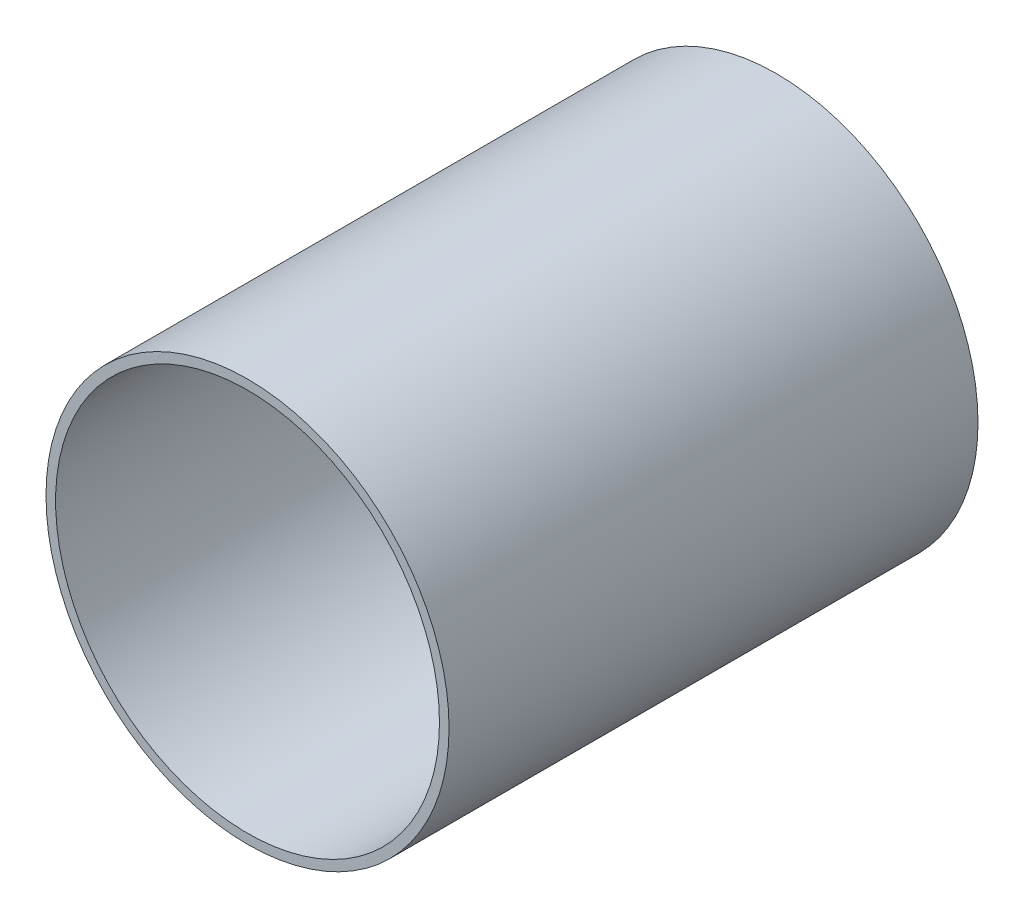
ISO-10303-21;
HEADER;
FILE_DESCRIPTION(('STEP AP214'),'2;1');
FILE_NAME('part.step','',(''),(''),'','','');
FILE_SCHEMA(('AUTOMOTIVE_DESIGN { 1 0 10303 214 1 1 1 1 }'));
ENDSEC;
DATA;
#1=APPLICATION_CONTEXT('core data for automotive mechanical design processes');
#2=APPLICATION_PROTOCOL_DEFINITION('international standard','automotive_design',2000,#1);
#3=PRODUCT_CONTEXT('',#1,'mechanical');
#4=PRODUCT('Part','Part','',(#3));
#5=PRODUCT_RELATED_PRODUCT_CATEGORY('part','',(#4));
#6=PRODUCT_DEFINITION_FORMATION('','',#4);
#7=PRODUCT_DEFINITION_CONTEXT('part definition',#1,'design');
#8=PRODUCT_DEFINITION('design','',#6,#7);
#9=PRODUCT_DEFINITION_SHAPE('','',#8);
#10=(LENGTH_UNIT() NAMED_UNIT(*) SI_UNIT(.MILLI.,.METRE.));
#11=(NAMED_UNIT(*) PLANE_ANGLE_UNIT() SI_UNIT($,.RADIAN.));
#12=(NAMED_UNIT(*) SI_UNIT($,.STERADIAN.) SOLID_ANGLE_UNIT());
#13=UNCERTAINTY_MEASURE_WITH_UNIT(LENGTH_MEASURE(1.E-05),#10,'distance_accuracy_value','');
#14=(GEOMETRIC_REPRESENTATION_CONTEXT(3) GLOBAL_UNCERTAINTY_ASSIGNED_CONTEXT((#13)) GLOBAL_UNIT_ASSIGNED_CONTEXT((#10,
#11,#12)) REPRESENTATION_CONTEXT('',''));
#15=CARTESIAN_POINT('',(0.,0.,0.));
#16=DIRECTION('',(0.,0.,1.));
#17=DIRECTION('',(1.,0.,0.));
#18=AXIS2_PLACEMENT_3D('',#15,#16,#17);
#19=CARTESIAN_POINT('',(0.,0.,0.));
#20=DIRECTION('',(0.,0.,-1.));
#21=DIRECTION('',(1.,0.,0.));
#22=AXIS2_PLACEMENT_3D('',#19,#20,#21);
#23=CYLINDRICAL_SURFACE('',#22,0.5334);
#24=CARTESIAN_POINT('',(0.,0.,1.39999974));
#25=DIRECTION('',(0.,0.,1.));
#26=DIRECTION('',(1.,0.,0.));
#27=AXIS2_PLACEMENT_3D('',#24,#25,#26);
#28=CIRCLE('',#27,0.5334);
#29=CARTESIAN_POINT('',(0.5334,0.,1.39999974));
#30=VERTEX_POINT('',#29);
#31=EDGE_CURVE('E11',#30,#30,#28,.T.);
#32=ORIENTED_EDGE('',*,*,#31,.F.);
#33=DIRECTION('',(0.,0.,1.));
#34=VECTOR('',#33,1.);
#35=CARTESIAN_POINT('',(0.5334,0.,0.));
#36=LINE('',#35,#34);
#37=CARTESIAN_POINT('',(0.5334,0.,0.));
#38=VERTEX_POINT('',#37);
#39=EDGE_CURVE('E24',#38,#30,#36,.T.);
#40=ORIENTED_EDGE('',*,*,#39,.F.);
#41=CARTESIAN_POINT('',(0.,0.,0.));
#42=DIRECTION('',(0.,0.,1.));
#43=DIRECTION('',(1.,0.,0.));
#44=AXIS2_PLACEMENT_3D('',#41,#42,#43);
#45=CIRCLE('',#44,0.5334);
#46=EDGE_CURVE('E46',#38,#38,#45,.T.);
#47=ORIENTED_EDGE('',*,*,#46,.T.);
#48=ORIENTED_EDGE('',*,*,#39,.T.);
#49=EDGE_LOOP('',(#32,#40,#47,#48));
#50=FACE_BOUND('',#49,.T.);
#51=ADVANCED_FACE('F17',(#50),#23,.T.);
#52=CARTESIAN_POINT('',(0.,0.,0.));
#53=DIRECTION('',(0.,0.,-1.));
#54=DIRECTION('',(1.,0.,0.));
#55=AXIS2_PLACEMENT_3D('',#52,#53,#54);
#56=CYLINDRICAL_SURFACE('',#55,0.508);
#57=DIRECTION('',(0.,0.,1.));
#58=VECTOR('',#57,1.);
#59=CARTESIAN_POINT('',(0.508,0.,0.));
#60=LINE('',#59,#58);
#61=CARTESIAN_POINT('',(0.508,0.,0.));
#62=VERTEX_POINT('',#61);
#63=CARTESIAN_POINT('',(0.508,0.,1.39999974));
#64=VERTEX_POINT('',#63);
#65=EDGE_CURVE('E40',#62,#64,#60,.T.);
#66=ORIENTED_EDGE('',*,*,#65,.T.);
#67=CARTESIAN_POINT('',(0.,0.,1.39999974));
#68=DIRECTION('',(0.,0.,1.));
#69=DIRECTION('',(1.,0.,0.));
#70=AXIS2_PLACEMENT_3D('',#67,#68,#69);
#71=CIRCLE('',#70,0.508);
#72=EDGE_CURVE('E45',#64,#64,#71,.T.);
#73=ORIENTED_EDGE('',*,*,#72,.T.);
#74=ORIENTED_EDGE('',*,*,#65,.F.);
#75=CARTESIAN_POINT('',(0.,0.,0.));
#76=DIRECTION('',(0.,0.,1.));
#77=DIRECTION('',(1.,0.,0.));
#78=AXIS2_PLACEMENT_3D('',#75,#76,#77);
#79=CIRCLE('',#78,0.508);
#80=EDGE_CURVE('E43',#62,#62,#79,.T.);
#81=ORIENTED_EDGE('',*,*,#80,.F.);
#82=EDGE_LOOP('',(#66,#73,#74,#81));
#83=FACE_BOUND('',#82,.T.);
#84=ADVANCED_FACE('F42',(#83),#56,.F.);
#85=CARTESIAN_POINT('',(0.5334,0.,0.));
#86=DIRECTION('',(0.,0.,-1.));
#87=DIRECTION('',(-1.,0.,0.));
#88=AXIS2_PLACEMENT_3D('',#85,#86,#87);
#89=PLANE('',#88);
#90=ORIENTED_EDGE('',*,*,#46,.F.);
#91=EDGE_LOOP('',(#90));
#92=FACE_BOUND('',#91,.T.);
#93=ORIENTED_EDGE('',*,*,#80,.T.);
#94=EDGE_LOOP('',(#93));
#95=FACE_BOUND('',#94,.T.);
#96=ADVANCED_FACE('F49',(#92,#95),#89,.T.);
#97=CARTESIAN_POINT('',(0.5334,0.,1.39999974));
#98=DIRECTION('',(0.,0.,-1.));
#99=DIRECTION('',(-1.,0.,0.));
#100=AXIS2_PLACEMENT_3D('',#97,#98,#99);
#101=PLANE('',#100);
#102=ORIENTED_EDGE('',*,*,#31,.T.);
#103=EDGE_LOOP('',(#102));
#104=FACE_BOUND('',#103,.T.);
#105=ORIENTED_EDGE('',*,*,#72,.F.);
#106=EDGE_LOOP('',(#105));
#107=FACE_BOUND('',#106,.T.);
#108=ADVANCED_FACE('F56',(#104,#107),#101,.F.);
#109=CLOSED_SHELL('',(#51,#84,#96,#108));
#110=MANIFOLD_SOLID_BREP('B1',#109);
#111=ADVANCED_BREP_SHAPE_REPRESENTATION('',(#18,#110),#14);
#112=SHAPE_DEFINITION_REPRESENTATION(#9,#111);
ENDSEC;
END-ISO-10303-21;
